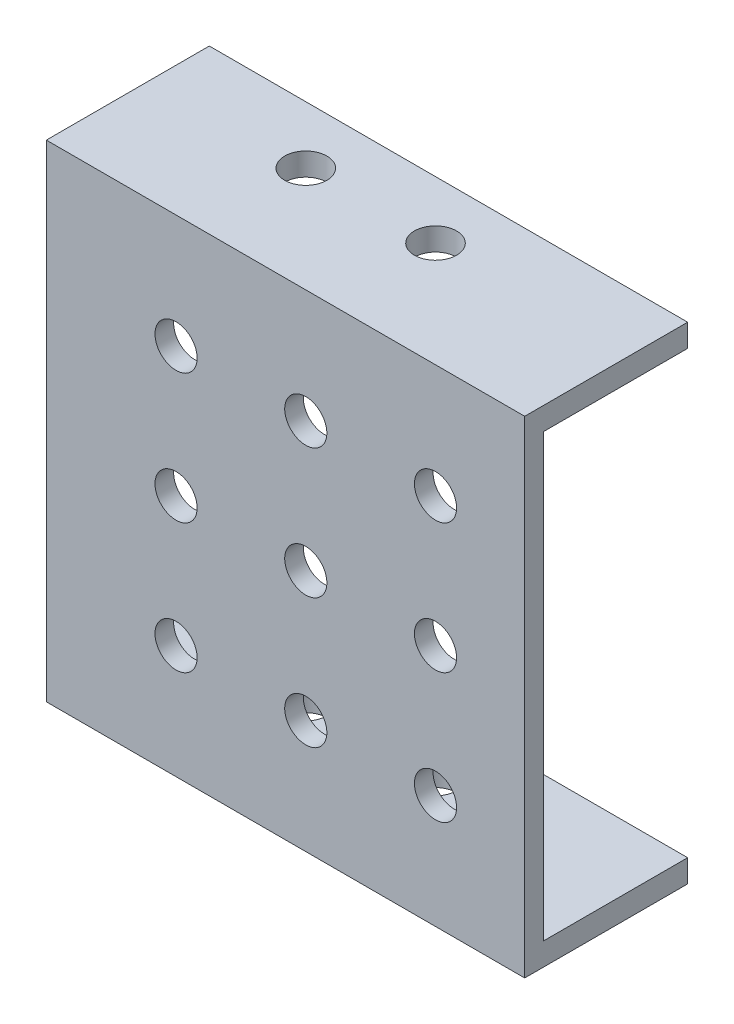
ISO-10303-21;
HEADER;
FILE_DESCRIPTION(('STEP AP214'),'2;1');
FILE_NAME('part.step','',(''),(''),'','','');
FILE_SCHEMA(('AUTOMOTIVE_DESIGN { 1 0 10303 214 1 1 1 1 }'));
ENDSEC;
DATA;
#1=APPLICATION_CONTEXT('core data for automotive mechanical design processes');
#2=APPLICATION_PROTOCOL_DEFINITION('international standard','automotive_design',2000,#1);
#3=PRODUCT_CONTEXT('',#1,'mechanical');
#4=PRODUCT('Part','Part','',(#3));
#5=PRODUCT_RELATED_PRODUCT_CATEGORY('part','',(#4));
#6=PRODUCT_DEFINITION_FORMATION('','',#4);
#7=PRODUCT_DEFINITION_CONTEXT('part definition',#1,'design');
#8=PRODUCT_DEFINITION('design','',#6,#7);
#9=PRODUCT_DEFINITION_SHAPE('','',#8);
#10=(LENGTH_UNIT() NAMED_UNIT(*) SI_UNIT(.MILLI.,.METRE.));
#11=(NAMED_UNIT(*) PLANE_ANGLE_UNIT() SI_UNIT($,.RADIAN.));
#12=(NAMED_UNIT(*) SI_UNIT($,.STERADIAN.) SOLID_ANGLE_UNIT());
#13=UNCERTAINTY_MEASURE_WITH_UNIT(LENGTH_MEASURE(1.E-05),#10,'distance_accuracy_value','');
#14=(GEOMETRIC_REPRESENTATION_CONTEXT(3) GLOBAL_UNCERTAINTY_ASSIGNED_CONTEXT((#13)) GLOBAL_UNIT_ASSIGNED_CONTEXT((#10,
#11,#12)) REPRESENTATION_CONTEXT('',''));
#15=CARTESIAN_POINT('',(0.,0.,0.));
#16=DIRECTION('',(0.,0.,1.));
#17=DIRECTION('',(1.,0.,0.));
#18=AXIS2_PLACEMENT_3D('',#15,#16,#17);
#19=CARTESIAN_POINT('',(-147.5,0.,0.));
#20=DIRECTION('',(0.,0.,1.));
#21=DIRECTION('',(1.,0.,0.));
#22=AXIS2_PLACEMENT_3D('',#19,#20,#21);
#23=PLANE('',#22);
#24=CARTESIAN_POINT('',(12.5,70.,0.));
#25=DIRECTION('',(0.,0.,1.));
#26=DIRECTION('',(1.,0.,0.));
#27=AXIS2_PLACEMENT_3D('',#24,#25,#26);
#28=CIRCLE('',#27,13.);
#29=CARTESIAN_POINT('',(25.5,70.,0.));
#30=VERTEX_POINT('',#29);
#31=EDGE_CURVE('E224',#30,#30,#28,.T.);
#32=ORIENTED_EDGE('',*,*,#31,.T.);
#33=EDGE_LOOP('',(#32));
#34=FACE_BOUND('',#33,.T.);
#35=CARTESIAN_POINT('',(-67.4999999999999,150.,0.));
#36=DIRECTION('',(0.,0.,1.));
#37=DIRECTION('',(1.,0.,0.));
#38=AXIS2_PLACEMENT_3D('',#35,#36,#37);
#39=CIRCLE('',#38,13.);
#40=CARTESIAN_POINT('',(-54.4999999999999,150.,0.));
#41=VERTEX_POINT('',#40);
#42=EDGE_CURVE('E236',#41,#41,#39,.T.);
#43=ORIENTED_EDGE('',*,*,#42,.T.);
#44=EDGE_LOOP('',(#43));
#45=FACE_BOUND('',#44,.T.);
#46=CARTESIAN_POINT('',(12.5,230.,0.));
#47=DIRECTION('',(0.,0.,1.));
#48=DIRECTION('',(1.,0.,0.));
#49=AXIS2_PLACEMENT_3D('',#46,#47,#48);
#50=CIRCLE('',#49,13.);
#51=CARTESIAN_POINT('',(25.5,230.,0.));
#52=VERTEX_POINT('',#51);
#53=EDGE_CURVE('E246',#52,#52,#50,.T.);
#54=ORIENTED_EDGE('',*,*,#53,.T.);
#55=EDGE_LOOP('',(#54));
#56=FACE_BOUND('',#55,.T.);
#57=CARTESIAN_POINT('',(92.5,150.,0.));
#58=DIRECTION('',(0.,0.,1.));
#59=DIRECTION('',(1.,0.,0.));
#60=AXIS2_PLACEMENT_3D('',#57,#58,#59);
#61=CIRCLE('',#60,13.);
#62=CARTESIAN_POINT('',(105.5,150.,0.));
#63=VERTEX_POINT('',#62);
#64=EDGE_CURVE('E256',#63,#63,#61,.T.);
#65=ORIENTED_EDGE('',*,*,#64,.T.);
#66=EDGE_LOOP('',(#65));
#67=FACE_BOUND('',#66,.T.);
#68=CARTESIAN_POINT('',(92.5,230.,0.));
#69=DIRECTION('',(0.,0.,1.));
#70=DIRECTION('',(1.,0.,0.));
#71=AXIS2_PLACEMENT_3D('',#68,#69,#70);
#72=CIRCLE('',#71,13.);
#73=CARTESIAN_POINT('',(105.5,230.,0.));
#74=VERTEX_POINT('',#73);
#75=EDGE_CURVE('E197',#74,#74,#72,.T.);
#76=ORIENTED_EDGE('',*,*,#75,.T.);
#77=EDGE_LOOP('',(#76));
#78=FACE_BOUND('',#77,.T.);
#79=CARTESIAN_POINT('',(92.5,70.,0.));
#80=DIRECTION('',(0.,0.,1.));
#81=DIRECTION('',(1.,0.,0.));
#82=AXIS2_PLACEMENT_3D('',#79,#80,#81);
#83=CIRCLE('',#82,13.);
#84=CARTESIAN_POINT('',(105.5,70.,0.));
#85=VERTEX_POINT('',#84);
#86=EDGE_CURVE('E252',#85,#85,#83,.T.);
#87=ORIENTED_EDGE('',*,*,#86,.T.);
#88=EDGE_LOOP('',(#87));
#89=FACE_BOUND('',#88,.T.);
#90=CARTESIAN_POINT('',(-67.4999999999999,230.,0.));
#91=DIRECTION('',(0.,0.,1.));
#92=DIRECTION('',(1.,0.,0.));
#93=AXIS2_PLACEMENT_3D('',#90,#91,#92);
#94=CIRCLE('',#93,13.);
#95=CARTESIAN_POINT('',(-54.4999999999999,230.,0.));
#96=VERTEX_POINT('',#95);
#97=EDGE_CURVE('E242',#96,#96,#94,.T.);
#98=ORIENTED_EDGE('',*,*,#97,.T.);
#99=EDGE_LOOP('',(#98));
#100=FACE_BOUND('',#99,.T.);
#101=CARTESIAN_POINT('',(-67.4999999999999,70.,0.));
#102=DIRECTION('',(0.,0.,1.));
#103=DIRECTION('',(1.,0.,0.));
#104=AXIS2_PLACEMENT_3D('',#101,#102,#103);
#105=CIRCLE('',#104,13.);
#106=CARTESIAN_POINT('',(-54.5,70.,0.));
#107=VERTEX_POINT('',#106);
#108=EDGE_CURVE('E233',#107,#107,#105,.T.);
#109=ORIENTED_EDGE('',*,*,#108,.T.);
#110=EDGE_LOOP('',(#109));
#111=FACE_BOUND('',#110,.T.);
#112=CARTESIAN_POINT('',(12.5,150.,0.));
#113=DIRECTION('',(0.,0.,1.));
#114=DIRECTION('',(1.,0.,0.));
#115=AXIS2_PLACEMENT_3D('',#112,#113,#114);
#116=CIRCLE('',#115,13.);
#117=CARTESIAN_POINT('',(25.5,150.,0.));
#118=VERTEX_POINT('',#117);
#119=EDGE_CURVE('E163',#118,#118,#116,.T.);
#120=ORIENTED_EDGE('',*,*,#119,.T.);
#121=EDGE_LOOP('',(#120));
#122=FACE_BOUND('',#121,.T.);
#123=DIRECTION('',(1.,0.,0.));
#124=VECTOR('',#123,1.);
#125=CARTESIAN_POINT('',(147.5,14.,0.));
#126=LINE('',#125,#124);
#127=CARTESIAN_POINT('',(-147.5,14.,0.));
#128=VERTEX_POINT('',#127);
#129=CARTESIAN_POINT('',(147.5,14.,0.));
#130=VERTEX_POINT('',#129);
#131=EDGE_CURVE('E121',#128,#130,#126,.T.);
#132=ORIENTED_EDGE('',*,*,#131,.F.);
#133=DIRECTION('',(0.,-1.,0.));
#134=VECTOR('',#133,1.);
#135=CARTESIAN_POINT('',(-147.5,300.,0.));
#136=LINE('',#135,#134);
#137=CARTESIAN_POINT('',(-147.5,286.,0.));
#138=VERTEX_POINT('',#137);
#139=EDGE_CURVE('E154',#138,#128,#136,.T.);
#140=ORIENTED_EDGE('',*,*,#139,.F.);
#141=DIRECTION('',(-1.,0.,0.));
#142=VECTOR('',#141,1.);
#143=CARTESIAN_POINT('',(147.5,286.,0.));
#144=LINE('',#143,#142);
#145=CARTESIAN_POINT('',(147.5,286.,0.));
#146=VERTEX_POINT('',#145);
#147=EDGE_CURVE('E133',#146,#138,#144,.T.);
#148=ORIENTED_EDGE('',*,*,#147,.F.);
#149=DIRECTION('',(0.,1.,0.));
#150=VECTOR('',#149,1.);
#151=CARTESIAN_POINT('',(147.5,300.,0.));
#152=LINE('',#151,#150);
#153=EDGE_CURVE('E57',#130,#146,#152,.T.);
#154=ORIENTED_EDGE('',*,*,#153,.F.);
#155=EDGE_LOOP('',(#132,#140,#148,#154));
#156=FACE_BOUND('',#155,.T.);
#157=ADVANCED_FACE('F35',(#34,#45,#56,#67,#78,#89,#100,#111,#122,#156),#23,.F.);
#158=CARTESIAN_POINT('',(-147.5,0.,11.5));
#159=DIRECTION('',(0.,0.,1.));
#160=DIRECTION('',(1.,0.,0.));
#161=AXIS2_PLACEMENT_3D('',#158,#159,#160);
#162=PLANE('',#161);
#163=CARTESIAN_POINT('',(12.5,70.,11.5));
#164=DIRECTION('',(0.,0.,1.));
#165=DIRECTION('',(1.,0.,0.));
#166=AXIS2_PLACEMENT_3D('',#163,#164,#165);
#167=CIRCLE('',#166,13.);
#168=CARTESIAN_POINT('',(25.5,70.,11.5));
#169=VERTEX_POINT('',#168);
#170=EDGE_CURVE('E226',#169,#169,#167,.T.);
#171=ORIENTED_EDGE('',*,*,#170,.F.);
#172=EDGE_LOOP('',(#171));
#173=FACE_BOUND('',#172,.T.);
#174=CARTESIAN_POINT('',(-67.4999999999999,150.,11.5));
#175=DIRECTION('',(0.,0.,1.));
#176=DIRECTION('',(1.,0.,0.));
#177=AXIS2_PLACEMENT_3D('',#174,#175,#176);
#178=CIRCLE('',#177,13.);
#179=CARTESIAN_POINT('',(-54.4999999999999,150.,11.5));
#180=VERTEX_POINT('',#179);
#181=EDGE_CURVE('E239',#180,#180,#178,.T.);
#182=ORIENTED_EDGE('',*,*,#181,.F.);
#183=EDGE_LOOP('',(#182));
#184=FACE_BOUND('',#183,.T.);
#185=CARTESIAN_POINT('',(12.5,230.,11.5));
#186=DIRECTION('',(0.,0.,1.));
#187=DIRECTION('',(1.,0.,0.));
#188=AXIS2_PLACEMENT_3D('',#185,#186,#187);
#189=CIRCLE('',#188,13.);
#190=CARTESIAN_POINT('',(25.5,230.,11.5));
#191=VERTEX_POINT('',#190);
#192=EDGE_CURVE('E249',#191,#191,#189,.T.);
#193=ORIENTED_EDGE('',*,*,#192,.F.);
#194=EDGE_LOOP('',(#193));
#195=FACE_BOUND('',#194,.T.);
#196=CARTESIAN_POINT('',(92.5,150.,11.5));
#197=DIRECTION('',(0.,0.,1.));
#198=DIRECTION('',(1.,0.,0.));
#199=AXIS2_PLACEMENT_3D('',#196,#197,#198);
#200=CIRCLE('',#199,13.);
#201=CARTESIAN_POINT('',(105.5,150.,11.5));
#202=VERTEX_POINT('',#201);
#203=EDGE_CURVE('E259',#202,#202,#200,.T.);
#204=ORIENTED_EDGE('',*,*,#203,.F.);
#205=EDGE_LOOP('',(#204));
#206=FACE_BOUND('',#205,.T.);
#207=DIRECTION('',(0.,-1.,0.));
#208=VECTOR('',#207,1.);
#209=CARTESIAN_POINT('',(-147.5,300.,11.5));
#210=LINE('',#209,#208);
#211=CARTESIAN_POINT('',(-147.5,300.,11.5));
#212=VERTEX_POINT('',#211);
#213=CARTESIAN_POINT('',(-147.5,0.,11.5));
#214=VERTEX_POINT('',#213);
#215=EDGE_CURVE('E167',#212,#214,#210,.T.);
#216=ORIENTED_EDGE('',*,*,#215,.T.);
#217=DIRECTION('',(1.,0.,0.));
#218=VECTOR('',#217,1.);
#219=CARTESIAN_POINT('',(-147.5,0.,11.5));
#220=LINE('',#219,#218);
#221=CARTESIAN_POINT('',(147.5,0.,11.5));
#222=VERTEX_POINT('',#221);
#223=EDGE_CURVE('E193',#214,#222,#220,.T.);
#224=ORIENTED_EDGE('',*,*,#223,.T.);
#225=DIRECTION('',(0.,1.,0.));
#226=VECTOR('',#225,1.);
#227=CARTESIAN_POINT('',(147.5,300.,11.5));
#228=LINE('',#227,#226);
#229=CARTESIAN_POINT('',(147.5,300.,11.5));
#230=VERTEX_POINT('',#229);
#231=EDGE_CURVE('E106',#222,#230,#228,.T.);
#232=ORIENTED_EDGE('',*,*,#231,.T.);
#233=DIRECTION('',(-1.,0.,0.));
#234=VECTOR('',#233,1.);
#235=CARTESIAN_POINT('',(-147.5,300.,11.5));
#236=LINE('',#235,#234);
#237=EDGE_CURVE('E175',#230,#212,#236,.T.);
#238=ORIENTED_EDGE('',*,*,#237,.T.);
#239=EDGE_LOOP('',(#216,#224,#232,#238));
#240=FACE_BOUND('',#239,.T.);
#241=CARTESIAN_POINT('',(92.5,230.,11.5));
#242=DIRECTION('',(0.,0.,1.));
#243=DIRECTION('',(1.,0.,0.));
#244=AXIS2_PLACEMENT_3D('',#241,#242,#243);
#245=CIRCLE('',#244,13.);
#246=CARTESIAN_POINT('',(105.5,230.,11.5));
#247=VERTEX_POINT('',#246);
#248=EDGE_CURVE('E208',#247,#247,#245,.T.);
#249=ORIENTED_EDGE('',*,*,#248,.F.);
#250=EDGE_LOOP('',(#249));
#251=FACE_BOUND('',#250,.T.);
#252=CARTESIAN_POINT('',(92.5,70.,11.5));
#253=DIRECTION('',(0.,0.,1.));
#254=DIRECTION('',(1.,0.,0.));
#255=AXIS2_PLACEMENT_3D('',#252,#253,#254);
#256=CIRCLE('',#255,13.);
#257=CARTESIAN_POINT('',(105.5,70.,11.5));
#258=VERTEX_POINT('',#257);
#259=EDGE_CURVE('E212',#258,#258,#256,.T.);
#260=ORIENTED_EDGE('',*,*,#259,.F.);
#261=EDGE_LOOP('',(#260));
#262=FACE_BOUND('',#261,.T.);
#263=CARTESIAN_POINT('',(-67.4999999999999,230.,11.5));
#264=DIRECTION('',(0.,0.,1.));
#265=DIRECTION('',(1.,0.,0.));
#266=AXIS2_PLACEMENT_3D('',#263,#264,#265);
#267=CIRCLE('',#266,13.);
#268=CARTESIAN_POINT('',(-54.4999999999999,230.,11.5));
#269=VERTEX_POINT('',#268);
#270=EDGE_CURVE('E216',#269,#269,#267,.T.);
#271=ORIENTED_EDGE('',*,*,#270,.F.);
#272=EDGE_LOOP('',(#271));
#273=FACE_BOUND('',#272,.T.);
#274=CARTESIAN_POINT('',(-67.4999999999999,70.,11.5));
#275=DIRECTION('',(0.,0.,1.));
#276=DIRECTION('',(1.,0.,0.));
#277=AXIS2_PLACEMENT_3D('',#274,#275,#276);
#278=CIRCLE('',#277,13.);
#279=CARTESIAN_POINT('',(-54.5,70.,11.5));
#280=VERTEX_POINT('',#279);
#281=EDGE_CURVE('E220',#280,#280,#278,.T.);
#282=ORIENTED_EDGE('',*,*,#281,.F.);
#283=EDGE_LOOP('',(#282));
#284=FACE_BOUND('',#283,.T.);
#285=CARTESIAN_POINT('',(12.5,150.,11.5));
#286=DIRECTION('',(0.,0.,1.));
#287=DIRECTION('',(1.,0.,0.));
#288=AXIS2_PLACEMENT_3D('',#285,#286,#287);
#289=CIRCLE('',#288,13.);
#290=CARTESIAN_POINT('',(25.5,150.,11.5));
#291=VERTEX_POINT('',#290);
#292=EDGE_CURVE('E148',#291,#291,#289,.T.);
#293=ORIENTED_EDGE('',*,*,#292,.F.);
#294=EDGE_LOOP('',(#293));
#295=FACE_BOUND('',#294,.T.);
#296=ADVANCED_FACE('F200',(#173,#184,#195,#206,#240,#251,#262,#273,#284,#295),#162,.T.);
#297=CARTESIAN_POINT('',(-147.5,300.,11.5));
#298=DIRECTION('',(1.,0.,0.));
#299=DIRECTION('',(0.,0.,-1.));
#300=AXIS2_PLACEMENT_3D('',#297,#298,#299);
#301=PLANE('',#300);
#302=DIRECTION('',(0.,0.,-1.));
#303=VECTOR('',#302,1.);
#304=CARTESIAN_POINT('',(-147.5,300.,11.5));
#305=LINE('',#304,#303);
#306=CARTESIAN_POINT('',(-147.5,300.,-89.));
#307=VERTEX_POINT('',#306);
#308=EDGE_CURVE('E173',#212,#307,#305,.T.);
#309=ORIENTED_EDGE('',*,*,#308,.T.);
#310=DIRECTION('',(0.,1.,0.));
#311=VECTOR('',#310,1.);
#312=CARTESIAN_POINT('',(-147.5,300.,-89.));
#313=LINE('',#312,#311);
#314=CARTESIAN_POINT('',(-147.5,286.,-89.));
#315=VERTEX_POINT('',#314);
#316=EDGE_CURVE('E139',#315,#307,#313,.T.);
#317=ORIENTED_EDGE('',*,*,#316,.F.);
#318=DIRECTION('',(0.,0.,1.));
#319=VECTOR('',#318,1.);
#320=CARTESIAN_POINT('',(-147.5,286.,-89.));
#321=LINE('',#320,#319);
#322=EDGE_CURVE('E145',#315,#138,#321,.T.);
#323=ORIENTED_EDGE('',*,*,#322,.T.);
#324=ORIENTED_EDGE('',*,*,#139,.T.);
#325=DIRECTION('',(0.,0.,1.));
#326=VECTOR('',#325,1.);
#327=CARTESIAN_POINT('',(-147.5,14.,-89.));
#328=LINE('',#327,#326);
#329=CARTESIAN_POINT('',(-147.5,14.,-89.));
#330=VERTEX_POINT('',#329);
#331=EDGE_CURVE('E131',#330,#128,#328,.T.);
#332=ORIENTED_EDGE('',*,*,#331,.F.);
#333=DIRECTION('',(0.,1.,0.));
#334=VECTOR('',#333,1.);
#335=CARTESIAN_POINT('',(-147.5,0.,-89.));
#336=LINE('',#335,#334);
#337=CARTESIAN_POINT('',(-147.5,0.,-89.));
#338=VERTEX_POINT('',#337);
#339=EDGE_CURVE('E116',#338,#330,#336,.T.);
#340=ORIENTED_EDGE('',*,*,#339,.F.);
#341=DIRECTION('',(0.,0.,-1.));
#342=VECTOR('',#341,1.);
#343=CARTESIAN_POINT('',(-147.5,0.,11.5));
#344=LINE('',#343,#342);
#345=EDGE_CURVE('E11',#214,#338,#344,.T.);
#346=ORIENTED_EDGE('',*,*,#345,.F.);
#347=ORIENTED_EDGE('',*,*,#215,.F.);
#348=EDGE_LOOP('',(#309,#317,#323,#324,#332,#340,#346,#347));
#349=FACE_BOUND('',#348,.T.);
#350=ADVANCED_FACE('F37',(#349),#301,.F.);
#351=CARTESIAN_POINT('',(-147.5,0.,11.5));
#352=DIRECTION('',(0.,1.,0.));
#353=DIRECTION('',(0.,0.,1.));
#354=AXIS2_PLACEMENT_3D('',#351,#352,#353);
#355=PLANE('',#354);
#356=CARTESIAN_POINT('',(-52.5,0.,-53.5));
#357=DIRECTION('',(0.,1.,0.));
#358=DIRECTION('',(0.,0.,1.));
#359=AXIS2_PLACEMENT_3D('',#356,#357,#358);
#360=CIRCLE('',#359,13.);
#361=CARTESIAN_POINT('',(-52.5,0.,-40.5));
#362=VERTEX_POINT('',#361);
#363=EDGE_CURVE('E298',#362,#362,#360,.T.);
#364=ORIENTED_EDGE('',*,*,#363,.T.);
#365=EDGE_LOOP('',(#364));
#366=FACE_BOUND('',#365,.T.);
#367=CARTESIAN_POINT('',(27.5,0.,-53.5));
#368=DIRECTION('',(0.,1.,0.));
#369=DIRECTION('',(0.,0.,1.));
#370=AXIS2_PLACEMENT_3D('',#367,#368,#369);
#371=CIRCLE('',#370,13.);
#372=CARTESIAN_POINT('',(27.5,0.,-40.5));
#373=VERTEX_POINT('',#372);
#374=EDGE_CURVE('E301',#373,#373,#371,.T.);
#375=ORIENTED_EDGE('',*,*,#374,.T.);
#376=EDGE_LOOP('',(#375));
#377=FACE_BOUND('',#376,.T.);
#378=ORIENTED_EDGE('',*,*,#345,.T.);
#379=DIRECTION('',(-1.,0.,0.));
#380=VECTOR('',#379,1.);
#381=CARTESIAN_POINT('',(147.5,0.,-89.));
#382=LINE('',#381,#380);
#383=CARTESIAN_POINT('',(147.5,0.,-89.));
#384=VERTEX_POINT('',#383);
#385=EDGE_CURVE('E111',#384,#338,#382,.T.);
#386=ORIENTED_EDGE('',*,*,#385,.F.);
#387=DIRECTION('',(0.,0.,-1.));
#388=VECTOR('',#387,1.);
#389=CARTESIAN_POINT('',(147.5,0.,11.5));
#390=LINE('',#389,#388);
#391=EDGE_CURVE('E44',#222,#384,#390,.T.);
#392=ORIENTED_EDGE('',*,*,#391,.F.);
#393=ORIENTED_EDGE('',*,*,#223,.F.);
#394=EDGE_LOOP('',(#378,#386,#392,#393));
#395=FACE_BOUND('',#394,.T.);
#396=ADVANCED_FACE('F112',(#366,#377,#395),#355,.F.);
#397=CARTESIAN_POINT('',(147.5,300.,11.5));
#398=DIRECTION('',(-1.,0.,0.));
#399=DIRECTION('',(0.,0.,1.));
#400=AXIS2_PLACEMENT_3D('',#397,#398,#399);
#401=PLANE('',#400);
#402=ORIENTED_EDGE('',*,*,#391,.T.);
#403=DIRECTION('',(0.,-1.,0.));
#404=VECTOR('',#403,1.);
#405=CARTESIAN_POINT('',(147.5,0.,-89.));
#406=LINE('',#405,#404);
#407=CARTESIAN_POINT('',(147.5,14.,-89.));
#408=VERTEX_POINT('',#407);
#409=EDGE_CURVE('E104',#408,#384,#406,.T.);
#410=ORIENTED_EDGE('',*,*,#409,.F.);
#411=DIRECTION('',(0.,0.,1.));
#412=VECTOR('',#411,1.);
#413=CARTESIAN_POINT('',(147.5,14.,-89.));
#414=LINE('',#413,#412);
#415=EDGE_CURVE('E52',#408,#130,#414,.T.);
#416=ORIENTED_EDGE('',*,*,#415,.T.);
#417=ORIENTED_EDGE('',*,*,#153,.T.);
#418=DIRECTION('',(0.,0.,1.));
#419=VECTOR('',#418,1.);
#420=CARTESIAN_POINT('',(147.5,286.,-89.));
#421=LINE('',#420,#419);
#422=CARTESIAN_POINT('',(147.5,286.,-89.));
#423=VERTEX_POINT('',#422);
#424=EDGE_CURVE('E158',#423,#146,#421,.T.);
#425=ORIENTED_EDGE('',*,*,#424,.F.);
#426=DIRECTION('',(0.,-1.,0.));
#427=VECTOR('',#426,1.);
#428=CARTESIAN_POINT('',(147.5,300.,-89.));
#429=LINE('',#428,#427);
#430=CARTESIAN_POINT('',(147.5,300.,-89.));
#431=VERTEX_POINT('',#430);
#432=EDGE_CURVE('E134',#431,#423,#429,.T.);
#433=ORIENTED_EDGE('',*,*,#432,.F.);
#434=DIRECTION('',(0.,0.,-1.));
#435=VECTOR('',#434,1.);
#436=CARTESIAN_POINT('',(147.5,300.,11.5));
#437=LINE('',#436,#435);
#438=EDGE_CURVE('E108',#230,#431,#437,.T.);
#439=ORIENTED_EDGE('',*,*,#438,.F.);
#440=ORIENTED_EDGE('',*,*,#231,.F.);
#441=EDGE_LOOP('',(#402,#410,#416,#417,#425,#433,#439,#440));
#442=FACE_BOUND('',#441,.T.);
#443=ADVANCED_FACE('F102',(#442),#401,.F.);
#444=CARTESIAN_POINT('',(-147.5,300.,11.5));
#445=DIRECTION('',(0.,-1.,0.));
#446=DIRECTION('',(0.,0.,-1.));
#447=AXIS2_PLACEMENT_3D('',#444,#445,#446);
#448=PLANE('',#447);
#449=CARTESIAN_POINT('',(-52.5,300.,-53.5));
#450=DIRECTION('',(0.,1.,0.));
#451=DIRECTION('',(0.,0.,1.));
#452=AXIS2_PLACEMENT_3D('',#449,#450,#451);
#453=CIRCLE('',#452,13.);
#454=CARTESIAN_POINT('',(-52.5,300.,-40.5));
#455=VERTEX_POINT('',#454);
#456=EDGE_CURVE('E311',#455,#455,#453,.T.);
#457=ORIENTED_EDGE('',*,*,#456,.F.);
#458=EDGE_LOOP('',(#457));
#459=FACE_BOUND('',#458,.T.);
#460=CARTESIAN_POINT('',(27.5,300.,-53.5));
#461=DIRECTION('',(0.,1.,0.));
#462=DIRECTION('',(0.,0.,1.));
#463=AXIS2_PLACEMENT_3D('',#460,#461,#462);
#464=CIRCLE('',#463,13.);
#465=CARTESIAN_POINT('',(27.5,300.,-40.5));
#466=VERTEX_POINT('',#465);
#467=EDGE_CURVE('E303',#466,#466,#464,.T.);
#468=ORIENTED_EDGE('',*,*,#467,.F.);
#469=EDGE_LOOP('',(#468));
#470=FACE_BOUND('',#469,.T.);
#471=ORIENTED_EDGE('',*,*,#438,.T.);
#472=DIRECTION('',(1.,0.,0.));
#473=VECTOR('',#472,1.);
#474=CARTESIAN_POINT('',(147.5,300.,-89.));
#475=LINE('',#474,#473);
#476=EDGE_CURVE('E142',#307,#431,#475,.T.);
#477=ORIENTED_EDGE('',*,*,#476,.F.);
#478=ORIENTED_EDGE('',*,*,#308,.F.);
#479=ORIENTED_EDGE('',*,*,#237,.F.);
#480=EDGE_LOOP('',(#471,#477,#478,#479));
#481=FACE_BOUND('',#480,.T.);
#482=ADVANCED_FACE('F179',(#459,#470,#481),#448,.F.);
#483=CARTESIAN_POINT('',(92.5,230.,11.5));
#484=DIRECTION('',(0.,0.,-1.));
#485=DIRECTION('',(-1.,0.,0.));
#486=AXIS2_PLACEMENT_3D('',#483,#484,#485);
#487=CYLINDRICAL_SURFACE('',#486,13.);
#488=ORIENTED_EDGE('',*,*,#248,.T.);
#489=EDGE_LOOP('',(#488));
#490=FACE_BOUND('',#489,.T.);
#491=ORIENTED_EDGE('',*,*,#75,.F.);
#492=EDGE_LOOP('',(#491));
#493=FACE_BOUND('',#492,.T.);
#494=ADVANCED_FACE('F269',(#490,#493),#487,.F.);
#495=CARTESIAN_POINT('',(92.5,150.,11.5));
#496=DIRECTION('',(0.,0.,-1.));
#497=DIRECTION('',(-1.,0.,0.));
#498=AXIS2_PLACEMENT_3D('',#495,#496,#497);
#499=CYLINDRICAL_SURFACE('',#498,13.);
#500=ORIENTED_EDGE('',*,*,#203,.T.);
#501=EDGE_LOOP('',(#500));
#502=FACE_BOUND('',#501,.T.);
#503=ORIENTED_EDGE('',*,*,#64,.F.);
#504=EDGE_LOOP('',(#503));
#505=FACE_BOUND('',#504,.T.);
#506=ADVANCED_FACE('F271',(#502,#505),#499,.F.);
#507=CARTESIAN_POINT('',(92.5,70.,11.5));
#508=DIRECTION('',(0.,0.,-1.));
#509=DIRECTION('',(-1.,0.,0.));
#510=AXIS2_PLACEMENT_3D('',#507,#508,#509);
#511=CYLINDRICAL_SURFACE('',#510,13.);
#512=ORIENTED_EDGE('',*,*,#259,.T.);
#513=EDGE_LOOP('',(#512));
#514=FACE_BOUND('',#513,.T.);
#515=ORIENTED_EDGE('',*,*,#86,.F.);
#516=EDGE_LOOP('',(#515));
#517=FACE_BOUND('',#516,.T.);
#518=ADVANCED_FACE('F277',(#514,#517),#511,.F.);
#519=CARTESIAN_POINT('',(12.5,230.,11.5));
#520=DIRECTION('',(0.,0.,-1.));
#521=DIRECTION('',(-1.,0.,0.));
#522=AXIS2_PLACEMENT_3D('',#519,#520,#521);
#523=CYLINDRICAL_SURFACE('',#522,13.);
#524=ORIENTED_EDGE('',*,*,#192,.T.);
#525=EDGE_LOOP('',(#524));
#526=FACE_BOUND('',#525,.T.);
#527=ORIENTED_EDGE('',*,*,#53,.F.);
#528=EDGE_LOOP('',(#527));
#529=FACE_BOUND('',#528,.T.);
#530=ADVANCED_FACE('F362',(#526,#529),#523,.F.);
#531=CARTESIAN_POINT('',(-67.4999999999999,230.,11.5));
#532=DIRECTION('',(0.,0.,-1.));
#533=DIRECTION('',(-1.,0.,0.));
#534=AXIS2_PLACEMENT_3D('',#531,#532,#533);
#535=CYLINDRICAL_SURFACE('',#534,13.);
#536=ORIENTED_EDGE('',*,*,#270,.T.);
#537=EDGE_LOOP('',(#536));
#538=FACE_BOUND('',#537,.T.);
#539=ORIENTED_EDGE('',*,*,#97,.F.);
#540=EDGE_LOOP('',(#539));
#541=FACE_BOUND('',#540,.T.);
#542=ADVANCED_FACE('F358',(#538,#541),#535,.F.);
#543=CARTESIAN_POINT('',(-67.4999999999999,150.,11.5));
#544=DIRECTION('',(0.,0.,-1.));
#545=DIRECTION('',(-1.,0.,0.));
#546=AXIS2_PLACEMENT_3D('',#543,#544,#545);
#547=CYLINDRICAL_SURFACE('',#546,13.);
#548=ORIENTED_EDGE('',*,*,#181,.T.);
#549=EDGE_LOOP('',(#548));
#550=FACE_BOUND('',#549,.T.);
#551=ORIENTED_EDGE('',*,*,#42,.F.);
#552=EDGE_LOOP('',(#551));
#553=FACE_BOUND('',#552,.T.);
#554=ADVANCED_FACE('F354',(#550,#553),#547,.F.);
#555=CARTESIAN_POINT('',(-67.4999999999999,70.,11.5));
#556=DIRECTION('',(0.,0.,-1.));
#557=DIRECTION('',(-1.,0.,0.));
#558=AXIS2_PLACEMENT_3D('',#555,#556,#557);
#559=CYLINDRICAL_SURFACE('',#558,13.);
#560=ORIENTED_EDGE('',*,*,#281,.T.);
#561=EDGE_LOOP('',(#560));
#562=FACE_BOUND('',#561,.T.);
#563=ORIENTED_EDGE('',*,*,#108,.F.);
#564=EDGE_LOOP('',(#563));
#565=FACE_BOUND('',#564,.T.);
#566=ADVANCED_FACE('F350',(#562,#565),#559,.F.);
#567=CARTESIAN_POINT('',(12.5,70.,11.5));
#568=DIRECTION('',(0.,0.,-1.));
#569=DIRECTION('',(-1.,0.,0.));
#570=AXIS2_PLACEMENT_3D('',#567,#568,#569);
#571=CYLINDRICAL_SURFACE('',#570,13.);
#572=ORIENTED_EDGE('',*,*,#170,.T.);
#573=EDGE_LOOP('',(#572));
#574=FACE_BOUND('',#573,.T.);
#575=ORIENTED_EDGE('',*,*,#31,.F.);
#576=EDGE_LOOP('',(#575));
#577=FACE_BOUND('',#576,.T.);
#578=ADVANCED_FACE('F347',(#574,#577),#571,.F.);
#579=CARTESIAN_POINT('',(12.5,150.,11.5));
#580=DIRECTION('',(0.,0.,-1.));
#581=DIRECTION('',(-1.,0.,0.));
#582=AXIS2_PLACEMENT_3D('',#579,#580,#581);
#583=CYLINDRICAL_SURFACE('',#582,13.);
#584=ORIENTED_EDGE('',*,*,#292,.T.);
#585=EDGE_LOOP('',(#584));
#586=FACE_BOUND('',#585,.T.);
#587=ORIENTED_EDGE('',*,*,#119,.F.);
#588=EDGE_LOOP('',(#587));
#589=FACE_BOUND('',#588,.T.);
#590=ADVANCED_FACE('F343',(#586,#589),#583,.F.);
#591=CARTESIAN_POINT('',(147.5,286.,-89.));
#592=DIRECTION('',(0.,1.,0.));
#593=DIRECTION('',(0.,0.,1.));
#594=AXIS2_PLACEMENT_3D('',#591,#592,#593);
#595=PLANE('',#594);
#596=CARTESIAN_POINT('',(-52.5,286.,-53.5));
#597=DIRECTION('',(0.,1.,0.));
#598=DIRECTION('',(0.,0.,1.));
#599=AXIS2_PLACEMENT_3D('',#596,#597,#598);
#600=CIRCLE('',#599,13.);
#601=CARTESIAN_POINT('',(-52.5,286.,-40.5));
#602=VERTEX_POINT('',#601);
#603=EDGE_CURVE('E307',#602,#602,#600,.T.);
#604=ORIENTED_EDGE('',*,*,#603,.T.);
#605=EDGE_LOOP('',(#604));
#606=FACE_BOUND('',#605,.T.);
#607=CARTESIAN_POINT('',(27.5,286.,-53.5));
#608=DIRECTION('',(0.,1.,0.));
#609=DIRECTION('',(0.,0.,1.));
#610=AXIS2_PLACEMENT_3D('',#607,#608,#609);
#611=CIRCLE('',#610,13.);
#612=CARTESIAN_POINT('',(27.5,286.,-40.5));
#613=VERTEX_POINT('',#612);
#614=EDGE_CURVE('E123',#613,#613,#611,.T.);
#615=ORIENTED_EDGE('',*,*,#614,.T.);
#616=EDGE_LOOP('',(#615));
#617=FACE_BOUND('',#616,.T.);
#618=ORIENTED_EDGE('',*,*,#147,.T.);
#619=ORIENTED_EDGE('',*,*,#322,.F.);
#620=DIRECTION('',(-1.,0.,0.));
#621=VECTOR('',#620,1.);
#622=CARTESIAN_POINT('',(147.5,286.,-89.));
#623=LINE('',#622,#621);
#624=EDGE_CURVE('E137',#423,#315,#623,.T.);
#625=ORIENTED_EDGE('',*,*,#624,.F.);
#626=ORIENTED_EDGE('',*,*,#424,.T.);
#627=EDGE_LOOP('',(#618,#619,#625,#626));
#628=FACE_BOUND('',#627,.T.);
#629=ADVANCED_FACE('F186',(#606,#617,#628),#595,.F.);
#630=CARTESIAN_POINT('',(147.5,286.,-89.));
#631=DIRECTION('',(0.,0.,-1.));
#632=DIRECTION('',(-1.,0.,0.));
#633=AXIS2_PLACEMENT_3D('',#630,#631,#632);
#634=PLANE('',#633);
#635=ORIENTED_EDGE('',*,*,#432,.T.);
#636=ORIENTED_EDGE('',*,*,#624,.T.);
#637=ORIENTED_EDGE('',*,*,#316,.T.);
#638=ORIENTED_EDGE('',*,*,#476,.T.);
#639=EDGE_LOOP('',(#635,#636,#637,#638));
#640=FACE_BOUND('',#639,.T.);
#641=ADVANCED_FACE('F183',(#640),#634,.T.);
#642=CARTESIAN_POINT('',(147.5,14.,-89.));
#643=DIRECTION('',(0.,-1.,0.));
#644=DIRECTION('',(1.,0.,0.));
#645=AXIS2_PLACEMENT_3D('',#642,#643,#644);
#646=PLANE('',#645);
#647=CARTESIAN_POINT('',(-52.5,14.,-53.5));
#648=DIRECTION('',(0.,-1.,0.));
#649=DIRECTION('',(1.,0.,0.));
#650=AXIS2_PLACEMENT_3D('',#647,#648,#649);
#651=CIRCLE('',#650,13.);
#652=CARTESIAN_POINT('',(-39.5,14.,-53.5));
#653=VERTEX_POINT('',#652);
#654=EDGE_CURVE('E39',#653,#653,#651,.T.);
#655=ORIENTED_EDGE('',*,*,#654,.T.);
#656=EDGE_LOOP('',(#655));
#657=FACE_BOUND('',#656,.T.);
#658=CARTESIAN_POINT('',(27.5,14.,-53.5));
#659=DIRECTION('',(0.,-1.,0.));
#660=DIRECTION('',(1.,0.,0.));
#661=AXIS2_PLACEMENT_3D('',#658,#659,#660);
#662=CIRCLE('',#661,13.);
#663=CARTESIAN_POINT('',(40.5,14.,-53.5));
#664=VERTEX_POINT('',#663);
#665=EDGE_CURVE('E168',#664,#664,#662,.T.);
#666=ORIENTED_EDGE('',*,*,#665,.T.);
#667=EDGE_LOOP('',(#666));
#668=FACE_BOUND('',#667,.T.);
#669=ORIENTED_EDGE('',*,*,#131,.T.);
#670=ORIENTED_EDGE('',*,*,#415,.F.);
#671=DIRECTION('',(1.,0.,0.));
#672=VECTOR('',#671,1.);
#673=CARTESIAN_POINT('',(147.5,14.,-89.));
#674=LINE('',#673,#672);
#675=EDGE_CURVE('E120',#330,#408,#674,.T.);
#676=ORIENTED_EDGE('',*,*,#675,.F.);
#677=ORIENTED_EDGE('',*,*,#331,.T.);
#678=EDGE_LOOP('',(#669,#670,#676,#677));
#679=FACE_BOUND('',#678,.T.);
#680=ADVANCED_FACE('F317',(#657,#668,#679),#646,.F.);
#681=CARTESIAN_POINT('',(147.5,0.,-89.));
#682=DIRECTION('',(0.,0.,1.));
#683=DIRECTION('',(1.,0.,0.));
#684=AXIS2_PLACEMENT_3D('',#681,#682,#683);
#685=PLANE('',#684);
#686=ORIENTED_EDGE('',*,*,#409,.T.);
#687=ORIENTED_EDGE('',*,*,#385,.T.);
#688=ORIENTED_EDGE('',*,*,#339,.T.);
#689=ORIENTED_EDGE('',*,*,#675,.T.);
#690=EDGE_LOOP('',(#686,#687,#688,#689));
#691=FACE_BOUND('',#690,.T.);
#692=ADVANCED_FACE('F118',(#691),#685,.F.);
#693=CARTESIAN_POINT('',(27.5,0.,-53.5));
#694=DIRECTION('',(0.,1.,0.));
#695=DIRECTION('',(0.,0.,1.));
#696=AXIS2_PLACEMENT_3D('',#693,#694,#695);
#697=CYLINDRICAL_SURFACE('',#696,13.);
#698=ORIENTED_EDGE('',*,*,#374,.F.);
#699=EDGE_LOOP('',(#698));
#700=FACE_BOUND('',#699,.T.);
#701=ORIENTED_EDGE('',*,*,#665,.F.);
#702=EDGE_LOOP('',(#701));
#703=FACE_BOUND('',#702,.T.);
#704=ADVANCED_FACE('F331',(#700,#703),#697,.F.);
#705=ORIENTED_EDGE('',*,*,#467,.T.);
#706=EDGE_LOOP('',(#705));
#707=FACE_BOUND('',#706,.T.);
#708=ORIENTED_EDGE('',*,*,#614,.F.);
#709=EDGE_LOOP('',(#708));
#710=FACE_BOUND('',#709,.T.);
#711=ADVANCED_FACE('F323',(#707,#710),#697,.F.);
#712=CARTESIAN_POINT('',(-52.5,0.,-53.5));
#713=DIRECTION('',(0.,1.,0.));
#714=DIRECTION('',(0.,0.,1.));
#715=AXIS2_PLACEMENT_3D('',#712,#713,#714);
#716=CYLINDRICAL_SURFACE('',#715,13.);
#717=ORIENTED_EDGE('',*,*,#363,.F.);
#718=EDGE_LOOP('',(#717));
#719=FACE_BOUND('',#718,.T.);
#720=ORIENTED_EDGE('',*,*,#654,.F.);
#721=EDGE_LOOP('',(#720));
#722=FACE_BOUND('',#721,.T.);
#723=ADVANCED_FACE('F320',(#719,#722),#716,.F.);
#724=ORIENTED_EDGE('',*,*,#456,.T.);
#725=EDGE_LOOP('',(#724));
#726=FACE_BOUND('',#725,.T.);
#727=ORIENTED_EDGE('',*,*,#603,.F.);
#728=EDGE_LOOP('',(#727));
#729=FACE_BOUND('',#728,.T.);
#730=ADVANCED_FACE('F322',(#726,#729),#716,.F.);
#731=CLOSED_SHELL('',(#157,#296,#350,#396,#443,#482,#494,#506,#518,#530,#542,#554,#566,#578,
#590,#629,#641,#680,#692,#704,#711,#723,#730));
#732=MANIFOLD_SOLID_BREP('B2',#731);
#733=ADVANCED_BREP_SHAPE_REPRESENTATION('',(#18,#732),#14);
#734=SHAPE_DEFINITION_REPRESENTATION(#9,#733);
ENDSEC;
END-ISO-10303-21;
